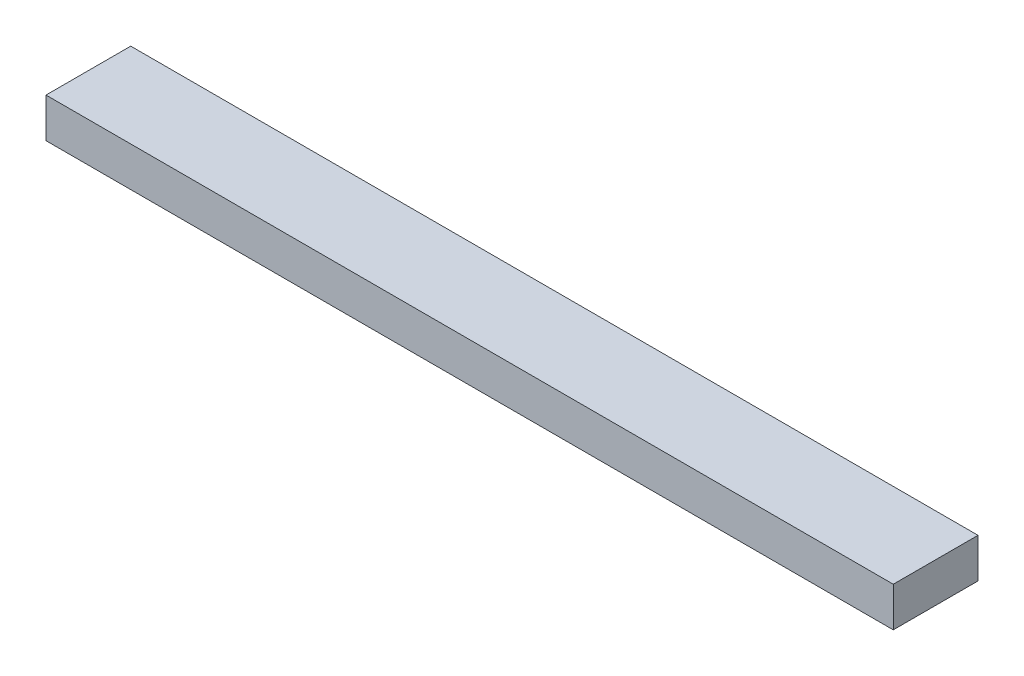
ISO-10303-21;
HEADER;
FILE_DESCRIPTION(('STEP AP214'),'2;1');
FILE_NAME('part.step','',(''),(''),'','','');
FILE_SCHEMA(('AUTOMOTIVE_DESIGN { 1 0 10303 214 1 1 1 1 }'));
ENDSEC;
DATA;
#1=APPLICATION_CONTEXT('core data for automotive mechanical design processes');
#2=APPLICATION_PROTOCOL_DEFINITION('international standard','automotive_design',2000,#1);
#3=PRODUCT_CONTEXT('',#1,'mechanical');
#4=PRODUCT('Part','Part','',(#3));
#5=PRODUCT_RELATED_PRODUCT_CATEGORY('part','',(#4));
#6=PRODUCT_DEFINITION_FORMATION('','',#4);
#7=PRODUCT_DEFINITION_CONTEXT('part definition',#1,'design');
#8=PRODUCT_DEFINITION('design','',#6,#7);
#9=PRODUCT_DEFINITION_SHAPE('','',#8);
#10=(LENGTH_UNIT() NAMED_UNIT(*) SI_UNIT(.MILLI.,.METRE.));
#11=(NAMED_UNIT(*) PLANE_ANGLE_UNIT() SI_UNIT($,.RADIAN.));
#12=(NAMED_UNIT(*) SI_UNIT($,.STERADIAN.) SOLID_ANGLE_UNIT());
#13=UNCERTAINTY_MEASURE_WITH_UNIT(LENGTH_MEASURE(1.E-05),#10,'distance_accuracy_value','');
#14=(GEOMETRIC_REPRESENTATION_CONTEXT(3) GLOBAL_UNCERTAINTY_ASSIGNED_CONTEXT((#13)) GLOBAL_UNIT_ASSIGNED_CONTEXT((#10,
#11,#12)) REPRESENTATION_CONTEXT('',''));
#15=CARTESIAN_POINT('',(0.,0.,0.));
#16=DIRECTION('',(0.,0.,1.));
#17=DIRECTION('',(1.,0.,0.));
#18=AXIS2_PLACEMENT_3D('',#15,#16,#17);
#19=CARTESIAN_POINT('',(-750.,0.,150.));
#20=DIRECTION('',(1.,0.,0.));
#21=DIRECTION('',(0.,0.,-1.));
#22=AXIS2_PLACEMENT_3D('',#19,#20,#21);
#23=PLANE('',#22);
#24=DIRECTION('',(0.,-1.,0.));
#25=VECTOR('',#24,1.);
#26=CARTESIAN_POINT('',(-750.,0.,0.));
#27=LINE('',#26,#25);
#28=CARTESIAN_POINT('',(-750.,0.,0.));
#29=VERTEX_POINT('',#28);
#30=CARTESIAN_POINT('',(-750.,-70.,0.));
#31=VERTEX_POINT('',#30);
#32=EDGE_CURVE('E98',#29,#31,#27,.T.);
#33=ORIENTED_EDGE('',*,*,#32,.T.);
#34=DIRECTION('',(0.,0.,-1.));
#35=VECTOR('',#34,1.);
#36=CARTESIAN_POINT('',(-750.,-70.,150.));
#37=LINE('',#36,#35);
#38=CARTESIAN_POINT('',(-750.,-70.,150.));
#39=VERTEX_POINT('',#38);
#40=EDGE_CURVE('E11',#39,#31,#37,.T.);
#41=ORIENTED_EDGE('',*,*,#40,.F.);
#42=DIRECTION('',(0.,-1.,0.));
#43=VECTOR('',#42,1.);
#44=CARTESIAN_POINT('',(-750.,0.,150.));
#45=LINE('',#44,#43);
#46=CARTESIAN_POINT('',(-750.,0.,150.));
#47=VERTEX_POINT('',#46);
#48=EDGE_CURVE('E86',#47,#39,#45,.T.);
#49=ORIENTED_EDGE('',*,*,#48,.F.);
#50=DIRECTION('',(0.,0.,-1.));
#51=VECTOR('',#50,1.);
#52=CARTESIAN_POINT('',(-750.,0.,150.));
#53=LINE('',#52,#51);
#54=EDGE_CURVE('E94',#47,#29,#53,.T.);
#55=ORIENTED_EDGE('',*,*,#54,.T.);
#56=EDGE_LOOP('',(#33,#41,#49,#55));
#57=FACE_BOUND('',#56,.T.);
#58=ADVANCED_FACE('F35',(#57),#23,.F.);
#59=CARTESIAN_POINT('',(-750.,-70.,150.));
#60=DIRECTION('',(0.,1.,0.));
#61=DIRECTION('',(0.,0.,1.));
#62=AXIS2_PLACEMENT_3D('',#59,#60,#61);
#63=PLANE('',#62);
#64=DIRECTION('',(1.,0.,0.));
#65=VECTOR('',#64,1.);
#66=CARTESIAN_POINT('',(-750.,-70.,0.));
#67=LINE('',#66,#65);
#68=CARTESIAN_POINT('',(750.,-70.,0.));
#69=VERTEX_POINT('',#68);
#70=EDGE_CURVE('E90',#31,#69,#67,.T.);
#71=ORIENTED_EDGE('',*,*,#70,.T.);
#72=DIRECTION('',(0.,0.,-1.));
#73=VECTOR('',#72,1.);
#74=CARTESIAN_POINT('',(750.,-70.,150.));
#75=LINE('',#74,#73);
#76=CARTESIAN_POINT('',(750.,-70.,150.));
#77=VERTEX_POINT('',#76);
#78=EDGE_CURVE('E43',#77,#69,#75,.T.);
#79=ORIENTED_EDGE('',*,*,#78,.F.);
#80=DIRECTION('',(1.,0.,0.));
#81=VECTOR('',#80,1.);
#82=CARTESIAN_POINT('',(-750.,-70.,150.));
#83=LINE('',#82,#81);
#84=EDGE_CURVE('E81',#39,#77,#83,.T.);
#85=ORIENTED_EDGE('',*,*,#84,.F.);
#86=ORIENTED_EDGE('',*,*,#40,.T.);
#87=EDGE_LOOP('',(#71,#79,#85,#86));
#88=FACE_BOUND('',#87,.T.);
#89=ADVANCED_FACE('F89',(#88),#63,.F.);
#90=CARTESIAN_POINT('',(750.,0.,150.));
#91=DIRECTION('',(-1.,0.,0.));
#92=DIRECTION('',(0.,0.,1.));
#93=AXIS2_PLACEMENT_3D('',#90,#91,#92);
#94=PLANE('',#93);
#95=DIRECTION('',(0.,1.,0.));
#96=VECTOR('',#95,1.);
#97=CARTESIAN_POINT('',(750.,0.,0.));
#98=LINE('',#97,#96);
#99=CARTESIAN_POINT('',(750.,0.,0.));
#100=VERTEX_POINT('',#99);
#101=EDGE_CURVE('E68',#69,#100,#98,.T.);
#102=ORIENTED_EDGE('',*,*,#101,.T.);
#103=DIRECTION('',(0.,0.,-1.));
#104=VECTOR('',#103,1.);
#105=CARTESIAN_POINT('',(750.,0.,150.));
#106=LINE('',#105,#104);
#107=CARTESIAN_POINT('',(750.,0.,150.));
#108=VERTEX_POINT('',#107);
#109=EDGE_CURVE('E91',#108,#100,#106,.T.);
#110=ORIENTED_EDGE('',*,*,#109,.F.);
#111=DIRECTION('',(0.,1.,0.));
#112=VECTOR('',#111,1.);
#113=CARTESIAN_POINT('',(750.,0.,150.));
#114=LINE('',#113,#112);
#115=EDGE_CURVE('E84',#77,#108,#114,.T.);
#116=ORIENTED_EDGE('',*,*,#115,.F.);
#117=ORIENTED_EDGE('',*,*,#78,.T.);
#118=EDGE_LOOP('',(#102,#110,#116,#117));
#119=FACE_BOUND('',#118,.T.);
#120=ADVANCED_FACE('F92',(#119),#94,.F.);
#121=CARTESIAN_POINT('',(-750.,0.,150.));
#122=DIRECTION('',(0.,-1.,0.));
#123=DIRECTION('',(1.,0.,0.));
#124=AXIS2_PLACEMENT_3D('',#121,#122,#123);
#125=PLANE('',#124);
#126=DIRECTION('',(-1.,0.,0.));
#127=VECTOR('',#126,1.);
#128=CARTESIAN_POINT('',(-750.,0.,0.));
#129=LINE('',#128,#127);
#130=EDGE_CURVE('E74',#100,#29,#129,.T.);
#131=ORIENTED_EDGE('',*,*,#130,.T.);
#132=ORIENTED_EDGE('',*,*,#54,.F.);
#133=DIRECTION('',(-1.,0.,0.));
#134=VECTOR('',#133,1.);
#135=CARTESIAN_POINT('',(-750.,0.,150.));
#136=LINE('',#135,#134);
#137=EDGE_CURVE('E51',#108,#47,#136,.T.);
#138=ORIENTED_EDGE('',*,*,#137,.F.);
#139=ORIENTED_EDGE('',*,*,#109,.T.);
#140=EDGE_LOOP('',(#131,#132,#138,#139));
#141=FACE_BOUND('',#140,.T.);
#142=ADVANCED_FACE('F105',(#141),#125,.F.);
#143=CARTESIAN_POINT('',(0.,0.,150.));
#144=DIRECTION('',(0.,0.,1.));
#145=DIRECTION('',(1.,0.,0.));
#146=AXIS2_PLACEMENT_3D('',#143,#144,#145);
#147=PLANE('',#146);
#148=ORIENTED_EDGE('',*,*,#48,.T.);
#149=ORIENTED_EDGE('',*,*,#84,.T.);
#150=ORIENTED_EDGE('',*,*,#115,.T.);
#151=ORIENTED_EDGE('',*,*,#137,.T.);
#152=EDGE_LOOP('',(#148,#149,#150,#151));
#153=FACE_BOUND('',#152,.T.);
#154=ADVANCED_FACE('F82',(#153),#147,.T.);
#155=CARTESIAN_POINT('',(0.,0.,0.));
#156=DIRECTION('',(0.,0.,1.));
#157=DIRECTION('',(1.,0.,0.));
#158=AXIS2_PLACEMENT_3D('',#155,#156,#157);
#159=PLANE('',#158);
#160=ORIENTED_EDGE('',*,*,#32,.F.);
#161=ORIENTED_EDGE('',*,*,#130,.F.);
#162=ORIENTED_EDGE('',*,*,#101,.F.);
#163=ORIENTED_EDGE('',*,*,#70,.F.);
#164=EDGE_LOOP('',(#160,#161,#162,#163));
#165=FACE_BOUND('',#164,.T.);
#166=ADVANCED_FACE('F108',(#165),#159,.F.);
#167=CLOSED_SHELL('',(#58,#89,#120,#142,#154,#166));
#168=MANIFOLD_SOLID_BREP('B2',#167);
#169=ADVANCED_BREP_SHAPE_REPRESENTATION('',(#18,#168),#14);
#170=SHAPE_DEFINITION_REPRESENTATION(#9,#169);
ENDSEC;
END-ISO-10303-21;
